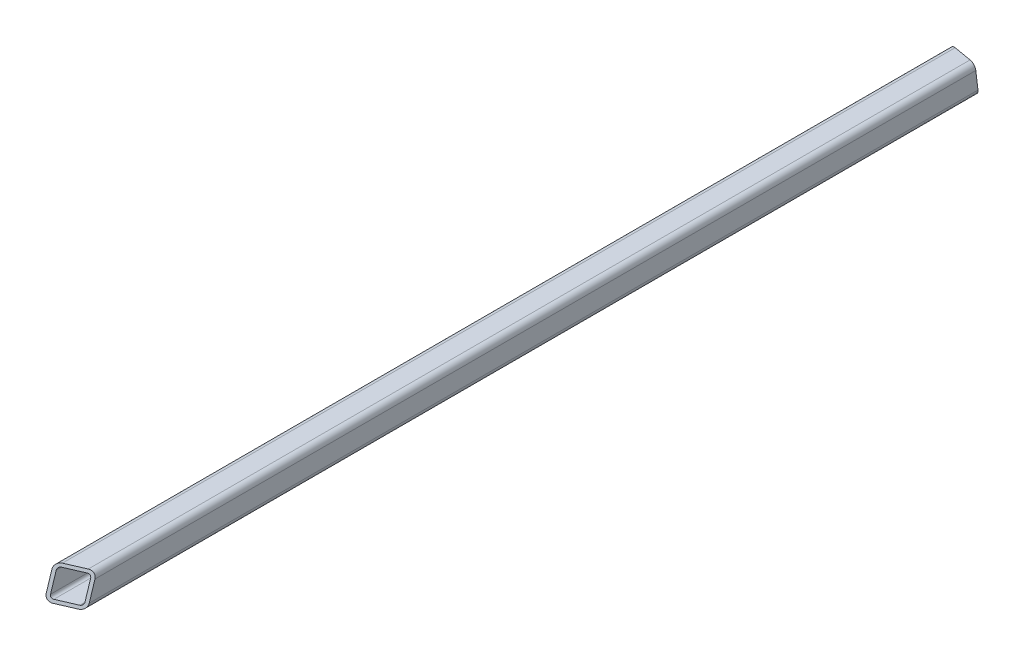
ISO-10303-21;
HEADER;
FILE_DESCRIPTION(('STEP AP214'),'2;1');
FILE_NAME('part.step','',(''),(''),'','','');
FILE_SCHEMA(('AUTOMOTIVE_DESIGN { 1 0 10303 214 1 1 1 1 }'));
ENDSEC;
DATA;
#1=APPLICATION_CONTEXT('core data for automotive mechanical design processes');
#2=APPLICATION_PROTOCOL_DEFINITION('international standard','automotive_design',2000,#1);
#3=PRODUCT_CONTEXT('',#1,'mechanical');
#4=PRODUCT('Part','Part','',(#3));
#5=PRODUCT_RELATED_PRODUCT_CATEGORY('part','',(#4));
#6=PRODUCT_DEFINITION_FORMATION('','',#4);
#7=PRODUCT_DEFINITION_CONTEXT('part definition',#1,'design');
#8=PRODUCT_DEFINITION('design','',#6,#7);
#9=PRODUCT_DEFINITION_SHAPE('','',#8);
#10=(LENGTH_UNIT() NAMED_UNIT(*) SI_UNIT(.MILLI.,.METRE.));
#11=(NAMED_UNIT(*) PLANE_ANGLE_UNIT() SI_UNIT($,.RADIAN.));
#12=(NAMED_UNIT(*) SI_UNIT($,.STERADIAN.) SOLID_ANGLE_UNIT());
#13=UNCERTAINTY_MEASURE_WITH_UNIT(LENGTH_MEASURE(1.E-05),#10,'distance_accuracy_value','');
#14=(GEOMETRIC_REPRESENTATION_CONTEXT(3) GLOBAL_UNCERTAINTY_ASSIGNED_CONTEXT((#13)) GLOBAL_UNIT_ASSIGNED_CONTEXT((#10,
#11,#12)) REPRESENTATION_CONTEXT('',''));
#15=CARTESIAN_POINT('',(0.,0.,0.));
#16=DIRECTION('',(0.,0.,1.));
#17=DIRECTION('',(1.,0.,0.));
#18=AXIS2_PLACEMENT_3D('',#15,#16,#17);
#19=CARTESIAN_POINT('',(66.0000000000001,-73.9999999999998,-1085.));
#20=DIRECTION('',(0.,0.,-1.));
#21=DIRECTION('',(0.,1.,0.));
#22=AXIS2_PLACEMENT_3D('',#19,#20,#21);
#23=CYLINDRICAL_SURFACE('',#22,4.);
#24=CARTESIAN_POINT('',(66.0000000000001,-73.9999999999998,-1678.25195921997));
#25=DIRECTION('',(0.168171921974834,0.116989163112928,-0.978790958465303));
#26=DIRECTION('',(-0.80349458926477,-0.558952757749405,-0.204861562101271));
#27=AXIS2_PLACEMENT_3D('',#24,#25,#26);
#28=ELLIPSE('',#27,4.08667444810873,4.);
#29=CARTESIAN_POINT('',(66.0000000000001,-69.9999999999998,-1677.77386259637));
#30=VERTEX_POINT('',#29);
#31=CARTESIAN_POINT('',(70.0000000000001,-73.9999999999998,-1677.56469532354));
#32=VERTEX_POINT('',#31);
#33=EDGE_CURVE('E185',#30,#32,#28,.T.);
#34=ORIENTED_EDGE('',*,*,#33,.F.);
#35=DIRECTION('',(0.,0.,-1.));
#36=VECTOR('',#35,1.);
#37=CARTESIAN_POINT('',(66.0000000000001,-69.9999999999998,-1085.));
#38=LINE('',#37,#36);
#39=CARTESIAN_POINT('',(66.0000000000001,-69.9999999999998,-1090.76380128051));
#40=VERTEX_POINT('',#39);
#41=EDGE_CURVE('E265',#40,#30,#38,.T.);
#42=ORIENTED_EDGE('',*,*,#41,.F.);
#43=CARTESIAN_POINT('',(66.0000000000001,-73.9999999999998,-1089.49752873556));
#44=DIRECTION('',(0.381589956920139,0.278969159106108,0.881229432693505));
#45=DIRECTION('',(0.7113947110933,0.520079684350194,-0.472688784460434));
#46=AXIS2_PLACEMENT_3D('',#43,#44,#45);
#47=ELLIPSE('',#46,4.53911302959307,4.);
#48=CARTESIAN_POINT('',(70.0000000000001,-73.9999999999997,-1091.22960868097));
#49=VERTEX_POINT('',#48);
#50=EDGE_CURVE('E176',#49,#40,#47,.T.);
#51=ORIENTED_EDGE('',*,*,#50,.F.);
#52=DIRECTION('',(0.,0.,-1.));
#53=VECTOR('',#52,1.);
#54=CARTESIAN_POINT('',(70.0000000000001,-73.9999999999998,-1085.));
#55=LINE('',#54,#53);
#56=EDGE_CURVE('E45',#49,#32,#55,.T.);
#57=ORIENTED_EDGE('',*,*,#56,.T.);
#58=EDGE_LOOP('',(#34,#42,#51,#57));
#59=FACE_BOUND('',#58,.T.);
#60=ADVANCED_FACE('F41',(#59),#23,.T.);
#61=CARTESIAN_POINT('',(66.0000000000001,-69.9999999999998,-1085.));
#62=DIRECTION('',(0.,-1.,0.));
#63=DIRECTION('',(0.,0.,-1.));
#64=AXIS2_PLACEMENT_3D('',#61,#62,#63);
#65=PLANE('',#64);
#66=DIRECTION('',(0.985558600813723,0.,0.169334711037329));
#67=VECTOR('',#66,1.);
#68=CARTESIAN_POINT('',(164.927603652661,-69.9999999999998,-1660.77652000881));
#69=LINE('',#68,#67);
#70=CARTESIAN_POINT('',(54.,-69.9999999999998,-1679.83565428564));
#71=VERTEX_POINT('',#70);
#72=EDGE_CURVE('E182',#71,#30,#69,.T.);
#73=ORIENTED_EDGE('',*,*,#72,.F.);
#74=DIRECTION('',(0.,0.,-1.));
#75=VECTOR('',#74,1.);
#76=CARTESIAN_POINT('',(54.0000000000001,-69.9999999999998,-1085.));
#77=LINE('',#76,#75);
#78=CARTESIAN_POINT('',(54.0000000000001,-69.9999999999998,-1085.56756144426));
#79=VERTEX_POINT('',#78);
#80=EDGE_CURVE('E263',#79,#71,#77,.T.);
#81=ORIENTED_EDGE('',*,*,#80,.F.);
#82=DIRECTION('',(-0.917660497954147,0.,0.397365336302183));
#83=VECTOR('',#82,1.);
#84=CARTESIAN_POINT('',(63.8982501955583,-69.9999999999998,-1089.85370160887));
#85=LINE('',#84,#83);
#86=EDGE_CURVE('E281',#40,#79,#85,.T.);
#87=ORIENTED_EDGE('',*,*,#86,.F.);
#88=ORIENTED_EDGE('',*,*,#41,.T.);
#89=EDGE_LOOP('',(#73,#81,#87,#88));
#90=FACE_BOUND('',#89,.T.);
#91=ADVANCED_FACE('F272',(#90),#65,.F.);
#92=CARTESIAN_POINT('',(54.0000000000001,-73.9999999999998,-1085.));
#93=DIRECTION('',(0.,0.,-1.));
#94=DIRECTION('',(0.,1.,0.));
#95=AXIS2_PLACEMENT_3D('',#92,#93,#94);
#96=CYLINDRICAL_SURFACE('',#95,4.);
#97=CARTESIAN_POINT('',(54.,-73.9999999999998,-1680.31375090924));
#98=DIRECTION('',(0.168171921974834,0.116989163112928,-0.978790958465303));
#99=DIRECTION('',(-0.80349458926477,-0.558952757749405,-0.204861562101271));
#100=AXIS2_PLACEMENT_3D('',#97,#98,#99);
#101=ELLIPSE('',#100,4.08667444810873,4.);
#102=CARTESIAN_POINT('',(50.,-73.9999999999998,-1681.00101480566));
#103=VERTEX_POINT('',#102);
#104=EDGE_CURVE('E11',#103,#71,#101,.T.);
#105=ORIENTED_EDGE('',*,*,#104,.F.);
#106=DIRECTION('',(0.,0.,-1.));
#107=VECTOR('',#106,1.);
#108=CARTESIAN_POINT('',(50.,-73.9999999999998,-1085.));
#109=LINE('',#108,#107);
#110=CARTESIAN_POINT('',(50.,-73.9999999999998,-1082.56920895388));
#111=VERTEX_POINT('',#110);
#112=EDGE_CURVE('E260',#111,#103,#109,.T.);
#113=ORIENTED_EDGE('',*,*,#112,.F.);
#114=CARTESIAN_POINT('',(54.0000000000001,-73.9999999999998,-1084.3012888993));
#115=DIRECTION('',(0.381589956920139,0.278969159106108,0.881229432693505));
#116=DIRECTION('',(0.7113947110933,0.520079684350194,-0.472688784460434));
#117=AXIS2_PLACEMENT_3D('',#114,#115,#116);
#118=ELLIPSE('',#117,4.53911302959307,4.);
#119=EDGE_CURVE('E278',#79,#111,#118,.T.);
#120=ORIENTED_EDGE('',*,*,#119,.F.);
#121=ORIENTED_EDGE('',*,*,#80,.T.);
#122=EDGE_LOOP('',(#105,#113,#120,#121));
#123=FACE_BOUND('',#122,.T.);
#124=ADVANCED_FACE('F275',(#123),#96,.T.);
#125=CARTESIAN_POINT('',(50.,-85.9999999999998,-1085.));
#126=DIRECTION('',(1.,0.,0.));
#127=DIRECTION('',(0.,0.,-1.));
#128=AXIS2_PLACEMENT_3D('',#125,#126,#127);
#129=PLANE('',#128);
#130=DIRECTION('',(0.,0.992932622114171,0.118679433523578));
#131=VECTOR('',#130,1.);
#132=CARTESIAN_POINT('',(50.,-15.5978167720356,-1674.02054315263));
#133=LINE('',#132,#131);
#134=CARTESIAN_POINT('',(50.,-85.9999999999999,-1682.43530467646));
#135=VERTEX_POINT('',#134);
#136=EDGE_CURVE('E51',#135,#103,#133,.T.);
#137=ORIENTED_EDGE('',*,*,#136,.F.);
#138=DIRECTION('',(0.,0.,-1.));
#139=VECTOR('',#138,1.);
#140=CARTESIAN_POINT('',(50.,-85.9999999999998,-1085.));
#141=LINE('',#140,#139);
#142=CARTESIAN_POINT('',(50.,-85.9999999999998,-1078.77039131902));
#143=VERTEX_POINT('',#142);
#144=EDGE_CURVE('E257',#143,#135,#141,.T.);
#145=ORIENTED_EDGE('',*,*,#144,.F.);
#146=DIRECTION('',(0.,-0.953369256848501,0.301806328787413));
#147=VECTOR('',#146,1.);
#148=CARTESIAN_POINT('',(50.,-84.2075367816794,-1079.33782805932));
#149=LINE('',#148,#147);
#150=EDGE_CURVE('E280',#111,#143,#149,.T.);
#151=ORIENTED_EDGE('',*,*,#150,.F.);
#152=ORIENTED_EDGE('',*,*,#112,.T.);
#153=EDGE_LOOP('',(#137,#145,#151,#152));
#154=FACE_BOUND('',#153,.T.);
#155=ADVANCED_FACE('F291',(#154),#129,.F.);
#156=CARTESIAN_POINT('',(54.0000000000001,-85.9999999999998,-1085.));
#157=DIRECTION('',(0.,0.,-1.));
#158=DIRECTION('',(0.,1.,0.));
#159=AXIS2_PLACEMENT_3D('',#156,#157,#158);
#160=CYLINDRICAL_SURFACE('',#159,4.);
#161=CARTESIAN_POINT('',(54.,-85.9999999999999,-1681.74804078003));
#162=DIRECTION('',(0.168171921974834,0.116989163112928,-0.978790958465303));
#163=DIRECTION('',(-0.80349458926477,-0.558952757749405,-0.204861562101271));
#164=AXIS2_PLACEMENT_3D('',#161,#162,#163);
#165=ELLIPSE('',#164,4.08667444810873,4.);
#166=CARTESIAN_POINT('',(54.,-89.9999999999999,-1682.22613740363));
#167=VERTEX_POINT('',#166);
#168=EDGE_CURVE('E200',#167,#135,#165,.T.);
#169=ORIENTED_EDGE('',*,*,#168,.F.);
#170=DIRECTION('',(0.,0.,-1.));
#171=VECTOR('',#170,1.);
#172=CARTESIAN_POINT('',(54.0000000000001,-89.9999999999998,-1085.));
#173=LINE('',#172,#171);
#174=CARTESIAN_POINT('',(54.0000000000001,-89.9999999999998,-1079.23619871949));
#175=VERTEX_POINT('',#174);
#176=EDGE_CURVE('E254',#175,#167,#173,.T.);
#177=ORIENTED_EDGE('',*,*,#176,.F.);
#178=CARTESIAN_POINT('',(54.0000000000001,-85.9999999999998,-1080.50247126444));
#179=DIRECTION('',(0.381589956920139,0.278969159106108,0.881229432693505));
#180=DIRECTION('',(0.7113947110933,0.520079684350194,-0.472688784460434));
#181=AXIS2_PLACEMENT_3D('',#178,#179,#180);
#182=ELLIPSE('',#181,4.53911302959307,4.);
#183=EDGE_CURVE('E187',#143,#175,#182,.T.);
#184=ORIENTED_EDGE('',*,*,#183,.F.);
#185=ORIENTED_EDGE('',*,*,#144,.T.);
#186=EDGE_LOOP('',(#169,#177,#184,#185));
#187=FACE_BOUND('',#186,.T.);
#188=ADVANCED_FACE('F289',(#187),#160,.T.);
#189=CARTESIAN_POINT('',(54.0000000000001,-89.9999999999998,-1085.));
#190=DIRECTION('',(0.,1.,0.));
#191=DIRECTION('',(0.,0.,1.));
#192=AXIS2_PLACEMENT_3D('',#189,#190,#191);
#193=PLANE('',#192);
#194=DIRECTION('',(-0.985558600813723,0.,-0.169334711037329));
#195=VECTOR('',#194,1.);
#196=CARTESIAN_POINT('',(153.670640593523,-89.9999999999999,-1665.10112920029));
#197=LINE('',#196,#195);
#198=CARTESIAN_POINT('',(66.,-89.9999999999999,-1680.16434571436));
#199=VERTEX_POINT('',#198);
#200=EDGE_CURVE('E203',#199,#167,#197,.T.);
#201=ORIENTED_EDGE('',*,*,#200,.F.);
#202=DIRECTION('',(0.,0.,-1.));
#203=VECTOR('',#202,1.);
#204=CARTESIAN_POINT('',(66.0000000000001,-89.9999999999998,-1085.));
#205=LINE('',#204,#203);
#206=CARTESIAN_POINT('',(66.0000000000001,-89.9999999999998,-1084.43243855574));
#207=VERTEX_POINT('',#206);
#208=EDGE_CURVE('E252',#207,#199,#205,.T.);
#209=ORIENTED_EDGE('',*,*,#208,.F.);
#210=DIRECTION('',(0.917660497954147,0.,-0.397365336302183));
#211=VECTOR('',#210,1.);
#212=CARTESIAN_POINT('',(56.1017498044419,-89.9999999999998,-1080.14629839113));
#213=LINE('',#212,#211);
#214=EDGE_CURVE('E181',#175,#207,#213,.T.);
#215=ORIENTED_EDGE('',*,*,#214,.F.);
#216=ORIENTED_EDGE('',*,*,#176,.T.);
#217=EDGE_LOOP('',(#201,#209,#215,#216));
#218=FACE_BOUND('',#217,.T.);
#219=ADVANCED_FACE('F293',(#218),#193,.F.);
#220=CARTESIAN_POINT('',(66.0000000000001,-85.9999999999998,-1085.));
#221=DIRECTION('',(0.,0.,-1.));
#222=DIRECTION('',(0.,1.,0.));
#223=AXIS2_PLACEMENT_3D('',#220,#221,#222);
#224=CYLINDRICAL_SURFACE('',#223,4.);
#225=CARTESIAN_POINT('',(66.0000000000001,-85.9999999999999,-1679.68624909076));
#226=DIRECTION('',(0.168171921974834,0.116989163112928,-0.978790958465303));
#227=DIRECTION('',(-0.80349458926477,-0.558952757749405,-0.204861562101271));
#228=AXIS2_PLACEMENT_3D('',#225,#226,#227);
#229=ELLIPSE('',#228,4.08667444810873,4.);
#230=CARTESIAN_POINT('',(70.0000000000001,-86.,-1678.99898519434));
#231=VERTEX_POINT('',#230);
#232=EDGE_CURVE('E164',#231,#199,#229,.T.);
#233=ORIENTED_EDGE('',*,*,#232,.F.);
#234=DIRECTION('',(0.,0.,-1.));
#235=VECTOR('',#234,1.);
#236=CARTESIAN_POINT('',(70.0000000000001,-85.9999999999998,-1085.));
#237=LINE('',#236,#235);
#238=CARTESIAN_POINT('',(70.0000000000001,-85.9999999999998,-1087.43079104611));
#239=VERTEX_POINT('',#238);
#240=EDGE_CURVE('E156',#239,#231,#237,.T.);
#241=ORIENTED_EDGE('',*,*,#240,.F.);
#242=CARTESIAN_POINT('',(66.0000000000001,-85.9999999999998,-1085.6987111007));
#243=DIRECTION('',(0.381589956920139,0.278969159106108,0.881229432693505));
#244=DIRECTION('',(0.7113947110933,0.520079684350194,-0.472688784460434));
#245=AXIS2_PLACEMENT_3D('',#242,#243,#244);
#246=ELLIPSE('',#245,4.53911302959307,4.);
#247=EDGE_CURVE('E161',#207,#239,#246,.T.);
#248=ORIENTED_EDGE('',*,*,#247,.F.);
#249=ORIENTED_EDGE('',*,*,#208,.T.);
#250=EDGE_LOOP('',(#233,#241,#248,#249));
#251=FACE_BOUND('',#250,.T.);
#252=ADVANCED_FACE('F158',(#251),#224,.T.);
#253=CARTESIAN_POINT('',(54.0000000000001,-73.9999999999998,-1085.));
#254=DIRECTION('',(0.,0.,-1.));
#255=DIRECTION('',(0.,1.,0.));
#256=AXIS2_PLACEMENT_3D('',#253,#254,#255);
#257=CYLINDRICAL_SURFACE('',#256,2.);
#258=DIRECTION('',(0.,0.,-1.));
#259=VECTOR('',#258,1.);
#260=CARTESIAN_POINT('',(52.,-73.9999999999998,-1085.));
#261=LINE('',#260,#259);
#262=CARTESIAN_POINT('',(52.,-73.9999999999997,-1083.43524892659));
#263=VERTEX_POINT('',#262);
#264=CARTESIAN_POINT('',(52.,-73.9999999999998,-1680.65738285745));
#265=VERTEX_POINT('',#264);
#266=EDGE_CURVE('E209',#263,#265,#261,.T.);
#267=ORIENTED_EDGE('',*,*,#266,.T.);
#268=CARTESIAN_POINT('',(54.,-73.9999999999998,-1680.31375090924));
#269=DIRECTION('',(0.168171921974834,0.116989163112928,-0.978790958465303));
#270=DIRECTION('',(-0.80349458926477,-0.558952757749405,-0.204861562101271));
#271=AXIS2_PLACEMENT_3D('',#268,#269,#270);
#272=ELLIPSE('',#271,2.04333722405436,2.);
#273=CARTESIAN_POINT('',(54.,-71.9999999999998,-1680.07470259744));
#274=VERTEX_POINT('',#273);
#275=EDGE_CURVE('E87',#265,#274,#272,.T.);
#276=ORIENTED_EDGE('',*,*,#275,.T.);
#277=DIRECTION('',(0.,0.,-1.));
#278=VECTOR('',#277,1.);
#279=CARTESIAN_POINT('',(54.0000000000001,-71.9999999999998,-1085.));
#280=LINE('',#279,#278);
#281=CARTESIAN_POINT('',(54.,-71.9999999999998,-1084.93442517178));
#282=VERTEX_POINT('',#281);
#283=EDGE_CURVE('E212',#282,#274,#280,.T.);
#284=ORIENTED_EDGE('',*,*,#283,.F.);
#285=CARTESIAN_POINT('',(54.0000000000001,-73.9999999999998,-1084.3012888993));
#286=DIRECTION('',(0.381589956920139,0.278969159106108,0.881229432693505));
#287=DIRECTION('',(0.7113947110933,0.520079684350194,-0.472688784460434));
#288=AXIS2_PLACEMENT_3D('',#285,#286,#287);
#289=ELLIPSE('',#288,2.26955651479654,2.);
#290=EDGE_CURVE('E208',#282,#263,#289,.T.);
#291=ORIENTED_EDGE('',*,*,#290,.T.);
#292=EDGE_LOOP('',(#267,#276,#284,#291));
#293=FACE_BOUND('',#292,.T.);
#294=ADVANCED_FACE('F301',(#293),#257,.F.);
#295=CARTESIAN_POINT('',(66.0000000000001,-71.9999999999998,-1085.));
#296=DIRECTION('',(0.,-1.,0.));
#297=DIRECTION('',(0.,0.,-1.));
#298=AXIS2_PLACEMENT_3D('',#295,#296,#297);
#299=PLANE('',#298);
#300=ORIENTED_EDGE('',*,*,#283,.T.);
#301=DIRECTION('',(0.985558600813723,0.,0.169334711037329));
#302=VECTOR('',#301,1.);
#303=CARTESIAN_POINT('',(164.967498253513,-71.9999999999998,-1661.00871379091));
#304=LINE('',#303,#302);
#305=CARTESIAN_POINT('',(66.0000000000001,-71.9999999999998,-1678.01291090817));
#306=VERTEX_POINT('',#305);
#307=EDGE_CURVE('E60',#274,#306,#304,.T.);
#308=ORIENTED_EDGE('',*,*,#307,.T.);
#309=DIRECTION('',(0.,0.,-1.));
#310=VECTOR('',#309,1.);
#311=CARTESIAN_POINT('',(66.0000000000001,-71.9999999999998,-1085.));
#312=LINE('',#311,#310);
#313=CARTESIAN_POINT('',(66.0000000000001,-71.9999999999998,-1090.13066500803));
#314=VERTEX_POINT('',#313);
#315=EDGE_CURVE('E217',#314,#306,#312,.T.);
#316=ORIENTED_EDGE('',*,*,#315,.F.);
#317=DIRECTION('',(-0.917660497954147,0.,0.397365336302183));
#318=VECTOR('',#317,1.);
#319=CARTESIAN_POINT('',(64.1291211038532,-71.9999999999998,-1089.32053705395));
#320=LINE('',#319,#318);
#321=EDGE_CURVE('E211',#314,#282,#320,.T.);
#322=ORIENTED_EDGE('',*,*,#321,.T.);
#323=EDGE_LOOP('',(#300,#308,#316,#322));
#324=FACE_BOUND('',#323,.T.);
#325=ADVANCED_FACE('F349',(#324),#299,.T.);
#326=CARTESIAN_POINT('',(66.0000000000001,-73.9999999999998,-1085.));
#327=DIRECTION('',(0.,0.,-1.));
#328=DIRECTION('',(0.,1.,0.));
#329=AXIS2_PLACEMENT_3D('',#326,#327,#328);
#330=CYLINDRICAL_SURFACE('',#329,2.);
#331=ORIENTED_EDGE('',*,*,#315,.T.);
#332=CARTESIAN_POINT('',(66.0000000000001,-73.9999999999998,-1678.25195921997));
#333=DIRECTION('',(0.168171921974834,0.116989163112928,-0.978790958465303));
#334=DIRECTION('',(-0.80349458926477,-0.558952757749405,-0.204861562101271));
#335=AXIS2_PLACEMENT_3D('',#332,#333,#334);
#336=ELLIPSE('',#335,2.04333722405436,2.);
#337=CARTESIAN_POINT('',(68.0000000000001,-73.9999999999997,-1677.90832727175));
#338=VERTEX_POINT('',#337);
#339=EDGE_CURVE('E213',#306,#338,#336,.T.);
#340=ORIENTED_EDGE('',*,*,#339,.T.);
#341=DIRECTION('',(0.,0.,-1.));
#342=VECTOR('',#341,1.);
#343=CARTESIAN_POINT('',(68.0000000000001,-73.9999999999998,-1085.));
#344=LINE('',#343,#342);
#345=CARTESIAN_POINT('',(68.0000000000001,-73.9999999999997,-1090.36356870827));
#346=VERTEX_POINT('',#345);
#347=EDGE_CURVE('E222',#346,#338,#344,.T.);
#348=ORIENTED_EDGE('',*,*,#347,.F.);
#349=CARTESIAN_POINT('',(66.0000000000001,-73.9999999999998,-1089.49752873556));
#350=DIRECTION('',(0.381589956920139,0.278969159106108,0.881229432693505));
#351=DIRECTION('',(0.7113947110933,0.520079684350194,-0.472688784460434));
#352=AXIS2_PLACEMENT_3D('',#349,#350,#351);
#353=ELLIPSE('',#352,2.26955651479654,2.);
#354=EDGE_CURVE('E216',#346,#314,#353,.T.);
#355=ORIENTED_EDGE('',*,*,#354,.T.);
#356=EDGE_LOOP('',(#331,#340,#348,#355));
#357=FACE_BOUND('',#356,.T.);
#358=ADVANCED_FACE('F357',(#357),#330,.F.);
#359=CARTESIAN_POINT('',(68.0000000000001,-73.9999999999998,-1085.));
#360=DIRECTION('',(-1.,0.,0.));
#361=DIRECTION('',(0.,0.,1.));
#362=AXIS2_PLACEMENT_3D('',#359,#360,#361);
#363=PLANE('',#362);
#364=ORIENTED_EDGE('',*,*,#347,.T.);
#365=DIRECTION('',(0.,-0.992932622114171,-0.118679433523578));
#366=VECTOR('',#365,1.);
#367=CARTESIAN_POINT('',(68.0000000000001,-4.13127887281906,-1669.55732735523));
#368=LINE('',#367,#366);
#369=CARTESIAN_POINT('',(68.0000000000001,-85.9999999999999,-1679.34261714255));
#370=VERTEX_POINT('',#369);
#371=EDGE_CURVE('E218',#338,#370,#368,.T.);
#372=ORIENTED_EDGE('',*,*,#371,.T.);
#373=DIRECTION('',(0.,0.,-1.));
#374=VECTOR('',#373,1.);
#375=CARTESIAN_POINT('',(68.0000000000001,-85.9999999999998,-1085.));
#376=LINE('',#375,#374);
#377=CARTESIAN_POINT('',(68.0000000000001,-85.9999999999998,-1086.56475107341));
#378=VERTEX_POINT('',#377);
#379=EDGE_CURVE('E227',#378,#370,#376,.T.);
#380=ORIENTED_EDGE('',*,*,#379,.F.);
#381=DIRECTION('',(0.,0.953369256848501,-0.301806328787413));
#382=VECTOR('',#381,1.);
#383=CARTESIAN_POINT('',(68.0000000000001,-75.5432750467714,-1089.87501700301));
#384=LINE('',#383,#382);
#385=EDGE_CURVE('E221',#378,#346,#384,.T.);
#386=ORIENTED_EDGE('',*,*,#385,.T.);
#387=EDGE_LOOP('',(#364,#372,#380,#386));
#388=FACE_BOUND('',#387,.T.);
#389=ADVANCED_FACE('F365',(#388),#363,.T.);
#390=CARTESIAN_POINT('',(66.0000000000001,-85.9999999999998,-1085.));
#391=DIRECTION('',(0.,0.,-1.));
#392=DIRECTION('',(0.,1.,0.));
#393=AXIS2_PLACEMENT_3D('',#390,#391,#392);
#394=CYLINDRICAL_SURFACE('',#393,2.);
#395=ORIENTED_EDGE('',*,*,#379,.T.);
#396=CARTESIAN_POINT('',(66.0000000000001,-85.9999999999999,-1679.68624909076));
#397=DIRECTION('',(0.168171921974834,0.116989163112928,-0.978790958465303));
#398=DIRECTION('',(-0.80349458926477,-0.558952757749405,-0.204861562101271));
#399=AXIS2_PLACEMENT_3D('',#396,#397,#398);
#400=ELLIPSE('',#399,2.04333722405436,2.);
#401=CARTESIAN_POINT('',(66.0000000000001,-87.9999999999999,-1679.92529740256));
#402=VERTEX_POINT('',#401);
#403=EDGE_CURVE('E223',#370,#402,#400,.T.);
#404=ORIENTED_EDGE('',*,*,#403,.T.);
#405=DIRECTION('',(0.,0.,-1.));
#406=VECTOR('',#405,1.);
#407=CARTESIAN_POINT('',(66.0000000000001,-87.9999999999998,-1085.));
#408=LINE('',#407,#406);
#409=CARTESIAN_POINT('',(66.0000000000001,-87.9999999999998,-1085.06557482822));
#410=VERTEX_POINT('',#409);
#411=EDGE_CURVE('E232',#410,#402,#408,.T.);
#412=ORIENTED_EDGE('',*,*,#411,.F.);
#413=CARTESIAN_POINT('',(66.0000000000001,-85.9999999999998,-1085.6987111007));
#414=DIRECTION('',(0.381589956920139,0.278969159106108,0.881229432693505));
#415=DIRECTION('',(0.7113947110933,0.520079684350194,-0.472688784460434));
#416=AXIS2_PLACEMENT_3D('',#413,#414,#415);
#417=ELLIPSE('',#416,2.26955651479654,2.);
#418=EDGE_CURVE('E226',#410,#378,#417,.T.);
#419=ORIENTED_EDGE('',*,*,#418,.T.);
#420=EDGE_LOOP('',(#395,#404,#412,#419));
#421=FACE_BOUND('',#420,.T.);
#422=ADVANCED_FACE('F373',(#421),#394,.F.);
#423=CARTESIAN_POINT('',(54.0000000000001,-87.9999999999998,-1085.));
#424=DIRECTION('',(0.,1.,0.));
#425=DIRECTION('',(0.,0.,1.));
#426=AXIS2_PLACEMENT_3D('',#423,#424,#425);
#427=PLANE('',#426);
#428=ORIENTED_EDGE('',*,*,#411,.T.);
#429=DIRECTION('',(-0.985558600813723,0.,-0.169334711037329));
#430=VECTOR('',#429,1.);
#431=CARTESIAN_POINT('',(153.630745992671,-87.9999999999999,-1664.8689354182));
#432=LINE('',#431,#430);
#433=CARTESIAN_POINT('',(54.,-87.9999999999999,-1681.98708909183));
#434=VERTEX_POINT('',#433);
#435=EDGE_CURVE('E228',#402,#434,#432,.T.);
#436=ORIENTED_EDGE('',*,*,#435,.T.);
#437=DIRECTION('',(0.,0.,-1.));
#438=VECTOR('',#437,1.);
#439=CARTESIAN_POINT('',(54.0000000000001,-87.9999999999998,-1085.));
#440=LINE('',#439,#438);
#441=CARTESIAN_POINT('',(54.0000000000001,-87.9999999999998,-1079.86933499197));
#442=VERTEX_POINT('',#441);
#443=EDGE_CURVE('E236',#442,#434,#440,.T.);
#444=ORIENTED_EDGE('',*,*,#443,.F.);
#445=DIRECTION('',(0.917660497954147,0.,-0.397365336302183));
#446=VECTOR('',#445,1.);
#447=CARTESIAN_POINT('',(55.870878896147,-87.9999999999998,-1080.67946294605));
#448=LINE('',#447,#446);
#449=EDGE_CURVE('E231',#442,#410,#448,.T.);
#450=ORIENTED_EDGE('',*,*,#449,.T.);
#451=EDGE_LOOP('',(#428,#436,#444,#450));
#452=FACE_BOUND('',#451,.T.);
#453=ADVANCED_FACE('F381',(#452),#427,.T.);
#454=CARTESIAN_POINT('',(54.0000000000001,-85.9999999999998,-1085.));
#455=DIRECTION('',(0.,0.,-1.));
#456=DIRECTION('',(0.,1.,0.));
#457=AXIS2_PLACEMENT_3D('',#454,#455,#456);
#458=CYLINDRICAL_SURFACE('',#457,2.);
#459=ORIENTED_EDGE('',*,*,#443,.T.);
#460=CARTESIAN_POINT('',(54.,-85.9999999999999,-1681.74804078003));
#461=DIRECTION('',(0.168171921974834,0.116989163112928,-0.978790958465303));
#462=DIRECTION('',(-0.80349458926477,-0.558952757749405,-0.204861562101271));
#463=AXIS2_PLACEMENT_3D('',#460,#461,#462);
#464=ELLIPSE('',#463,2.04333722405436,2.);
#465=CARTESIAN_POINT('',(52.,-86.,-1682.09167272825));
#466=VERTEX_POINT('',#465);
#467=EDGE_CURVE('E233',#434,#466,#464,.T.);
#468=ORIENTED_EDGE('',*,*,#467,.T.);
#469=DIRECTION('',(0.,0.,-1.));
#470=VECTOR('',#469,1.);
#471=CARTESIAN_POINT('',(52.,-85.9999999999998,-1085.));
#472=LINE('',#471,#470);
#473=CARTESIAN_POINT('',(52.,-85.9999999999998,-1079.63643129173));
#474=VERTEX_POINT('',#473);
#475=EDGE_CURVE('E194',#474,#466,#472,.T.);
#476=ORIENTED_EDGE('',*,*,#475,.F.);
#477=CARTESIAN_POINT('',(54.0000000000001,-85.9999999999998,-1080.50247126444));
#478=DIRECTION('',(0.381589956920139,0.278969159106108,0.881229432693505));
#479=DIRECTION('',(0.7113947110933,0.520079684350194,-0.472688784460434));
#480=AXIS2_PLACEMENT_3D('',#477,#478,#479);
#481=ELLIPSE('',#480,2.26955651479654,2.);
#482=EDGE_CURVE('E235',#474,#442,#481,.T.);
#483=ORIENTED_EDGE('',*,*,#482,.T.);
#484=EDGE_LOOP('',(#459,#468,#476,#483));
#485=FACE_BOUND('',#484,.T.);
#486=ADVANCED_FACE('F389',(#485),#458,.F.);
#487=CARTESIAN_POINT('',(52.,-85.9999999999998,-1085.));
#488=DIRECTION('',(1.,0.,0.));
#489=DIRECTION('',(0.,0.,-1.));
#490=AXIS2_PLACEMENT_3D('',#487,#488,#489);
#491=PLANE('',#490);
#492=ORIENTED_EDGE('',*,*,#475,.T.);
#493=DIRECTION('',(0.,0.992932622114171,0.118679433523578));
#494=VECTOR('',#493,1.);
#495=CARTESIAN_POINT('',(52.,-15.6383105948674,-1673.68175119441));
#496=LINE('',#495,#494);
#497=EDGE_CURVE('E82',#466,#265,#496,.T.);
#498=ORIENTED_EDGE('',*,*,#497,.T.);
#499=ORIENTED_EDGE('',*,*,#266,.F.);
#500=DIRECTION('',(0.,-0.953369256848501,0.301806328787413));
#501=VECTOR('',#500,1.);
#502=CARTESIAN_POINT('',(52.,-84.4567249532281,-1080.12498299699));
#503=LINE('',#502,#501);
#504=EDGE_CURVE('E169',#263,#474,#503,.T.);
#505=ORIENTED_EDGE('',*,*,#504,.T.);
#506=EDGE_LOOP('',(#492,#498,#499,#505));
#507=FACE_BOUND('',#506,.T.);
#508=ADVANCED_FACE('F397',(#507),#491,.T.);
#509=CARTESIAN_POINT('',(70.0000000000001,-73.9999999999998,-1085.));
#510=DIRECTION('',(-1.,0.,0.));
#511=DIRECTION('',(0.,0.,1.));
#512=AXIS2_PLACEMENT_3D('',#509,#510,#511);
#513=PLANE('',#512);
#514=DIRECTION('',(0.,-0.992932622114171,-0.118679433523578));
#515=VECTOR('',#514,1.);
#516=CARTESIAN_POINT('',(70.0000000000001,-4.17177269565081,-1669.21853539701));
#517=LINE('',#516,#515);
#518=EDGE_CURVE('E196',#32,#231,#517,.T.);
#519=ORIENTED_EDGE('',*,*,#518,.F.);
#520=ORIENTED_EDGE('',*,*,#56,.F.);
#521=DIRECTION('',(0.,0.953369256848501,-0.301806328787413));
#522=VECTOR('',#521,1.);
#523=CARTESIAN_POINT('',(70.0000000000001,-75.7924632183202,-1090.66217194067));
#524=LINE('',#523,#522);
#525=EDGE_CURVE('E168',#239,#49,#524,.T.);
#526=ORIENTED_EDGE('',*,*,#525,.F.);
#527=ORIENTED_EDGE('',*,*,#240,.T.);
#528=EDGE_LOOP('',(#519,#520,#526,#527));
#529=FACE_BOUND('',#528,.T.);
#530=ADVANCED_FACE('F172',(#529),#513,.F.);
#531=CARTESIAN_POINT('',(60.,-79.9999999999999,-1085.));
#532=DIRECTION('',(0.381589956920139,0.278969159106108,0.881229432693505));
#533=DIRECTION('',(0.917660497954147,0.,-0.397365336302183));
#534=AXIS2_PLACEMENT_3D('',#531,#532,#533);
#535=PLANE('',#534);
#536=ORIENTED_EDGE('',*,*,#290,.F.);
#537=ORIENTED_EDGE('',*,*,#321,.F.);
#538=ORIENTED_EDGE('',*,*,#354,.F.);
#539=ORIENTED_EDGE('',*,*,#385,.F.);
#540=ORIENTED_EDGE('',*,*,#418,.F.);
#541=ORIENTED_EDGE('',*,*,#449,.F.);
#542=ORIENTED_EDGE('',*,*,#482,.F.);
#543=ORIENTED_EDGE('',*,*,#504,.F.);
#544=EDGE_LOOP('',(#536,#537,#538,#539,#540,#541,#542,#543));
#545=FACE_BOUND('',#544,.T.);
#546=ORIENTED_EDGE('',*,*,#525,.T.);
#547=ORIENTED_EDGE('',*,*,#50,.T.);
#548=ORIENTED_EDGE('',*,*,#86,.T.);
#549=ORIENTED_EDGE('',*,*,#119,.T.);
#550=ORIENTED_EDGE('',*,*,#150,.T.);
#551=ORIENTED_EDGE('',*,*,#183,.T.);
#552=ORIENTED_EDGE('',*,*,#214,.T.);
#553=ORIENTED_EDGE('',*,*,#247,.T.);
#554=EDGE_LOOP('',(#546,#547,#548,#549,#550,#551,#552,#553));
#555=FACE_BOUND('',#554,.T.);
#556=ADVANCED_FACE('F179',(#545,#555),#535,.T.);
#557=CARTESIAN_POINT('',(60.,-80.,-1680.));
#558=DIRECTION('',(0.168171921974834,0.116989163112928,-0.978790958465303));
#559=DIRECTION('',(-0.985558600813723,0.,-0.169334711037329));
#560=AXIS2_PLACEMENT_3D('',#557,#558,#559);
#561=PLANE('',#560);
#562=ORIENTED_EDGE('',*,*,#275,.F.);
#563=ORIENTED_EDGE('',*,*,#497,.F.);
#564=ORIENTED_EDGE('',*,*,#467,.F.);
#565=ORIENTED_EDGE('',*,*,#435,.F.);
#566=ORIENTED_EDGE('',*,*,#403,.F.);
#567=ORIENTED_EDGE('',*,*,#371,.F.);
#568=ORIENTED_EDGE('',*,*,#339,.F.);
#569=ORIENTED_EDGE('',*,*,#307,.F.);
#570=EDGE_LOOP('',(#562,#563,#564,#565,#566,#567,#568,#569));
#571=FACE_BOUND('',#570,.T.);
#572=ORIENTED_EDGE('',*,*,#72,.T.);
#573=ORIENTED_EDGE('',*,*,#33,.T.);
#574=ORIENTED_EDGE('',*,*,#518,.T.);
#575=ORIENTED_EDGE('',*,*,#232,.T.);
#576=ORIENTED_EDGE('',*,*,#200,.T.);
#577=ORIENTED_EDGE('',*,*,#168,.T.);
#578=ORIENTED_EDGE('',*,*,#136,.T.);
#579=ORIENTED_EDGE('',*,*,#104,.T.);
#580=EDGE_LOOP('',(#572,#573,#574,#575,#576,#577,#578,#579));
#581=FACE_BOUND('',#580,.T.);
#582=ADVANCED_FACE('F43',(#571,#581),#561,.T.);
#583=CLOSED_SHELL('',(#60,#91,#124,#155,#188,#219,#252,#294,#325,#358,#389,#422,#453,#486,#508,
#530,#556,#582));
#584=MANIFOLD_SOLID_BREP('B2',#583);
#585=ADVANCED_BREP_SHAPE_REPRESENTATION('',(#18,#584),#14);
#586=SHAPE_DEFINITION_REPRESENTATION(#9,#585);
ENDSEC;
END-ISO-10303-21;
